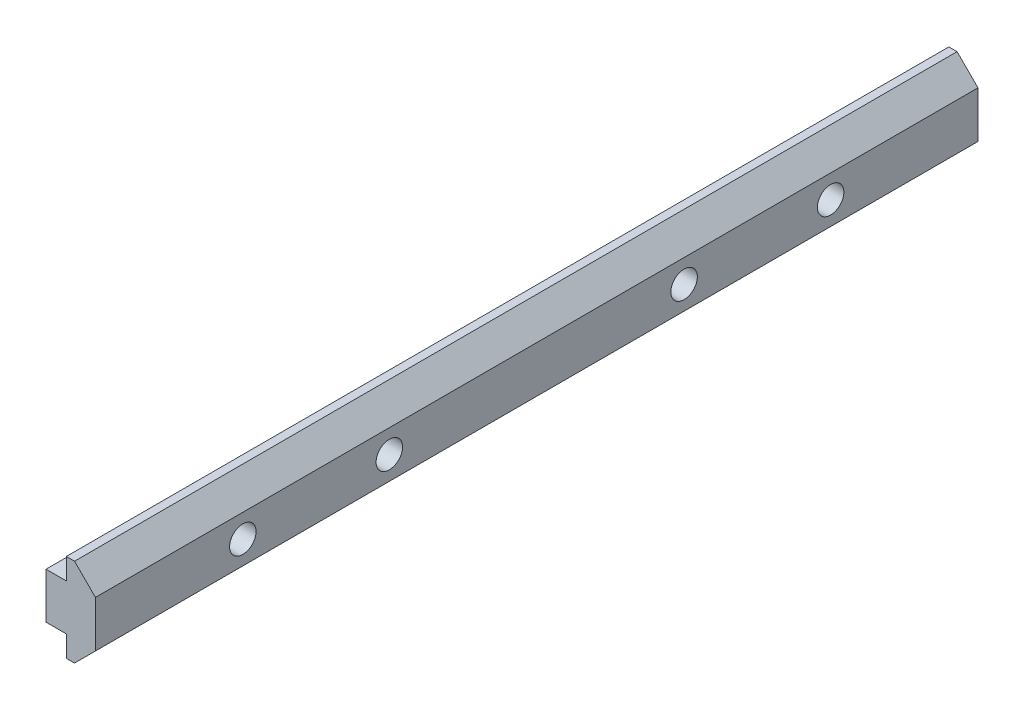
ISO-10303-21;
HEADER;
FILE_DESCRIPTION(('STEP AP214'),'2;1');
FILE_NAME('part.step','',(''),(''),'','','');
FILE_SCHEMA(('AUTOMOTIVE_DESIGN { 1 0 10303 214 1 1 1 1 }'));
ENDSEC;
DATA;
#1=APPLICATION_CONTEXT('core data for automotive mechanical design processes');
#2=APPLICATION_PROTOCOL_DEFINITION('international standard','automotive_design',2000,#1);
#3=PRODUCT_CONTEXT('',#1,'mechanical');
#4=PRODUCT('Part','Part','',(#3));
#5=PRODUCT_RELATED_PRODUCT_CATEGORY('part','',(#4));
#6=PRODUCT_DEFINITION_FORMATION('','',#4);
#7=PRODUCT_DEFINITION_CONTEXT('part definition',#1,'design');
#8=PRODUCT_DEFINITION('design','',#6,#7);
#9=PRODUCT_DEFINITION_SHAPE('','',#8);
#10=(LENGTH_UNIT() NAMED_UNIT(*) SI_UNIT(.MILLI.,.METRE.));
#11=(NAMED_UNIT(*) PLANE_ANGLE_UNIT() SI_UNIT($,.RADIAN.));
#12=(NAMED_UNIT(*) SI_UNIT($,.STERADIAN.) SOLID_ANGLE_UNIT());
#13=UNCERTAINTY_MEASURE_WITH_UNIT(LENGTH_MEASURE(1.E-05),#10,'distance_accuracy_value','');
#14=(GEOMETRIC_REPRESENTATION_CONTEXT(3) GLOBAL_UNCERTAINTY_ASSIGNED_CONTEXT((#13)) GLOBAL_UNIT_ASSIGNED_CONTEXT((#10,
#11,#12)) REPRESENTATION_CONTEXT('',''));
#15=CARTESIAN_POINT('',(0.,0.,0.));
#16=DIRECTION('',(0.,0.,1.));
#17=DIRECTION('',(1.,0.,0.));
#18=AXIS2_PLACEMENT_3D('',#15,#16,#17);
#19=CARTESIAN_POINT('',(-10.,-2.60000000000014,100.));
#20=DIRECTION('',(1.,0.,0.));
#21=DIRECTION('',(0.,0.,-1.));
#22=AXIS2_PLACEMENT_3D('',#19,#20,#21);
#23=PLANE('',#22);
#24=CARTESIAN_POINT('',(-10.,-1.4810201676152E-13,83.3));
#25=DIRECTION('',(-1.,0.,0.));
#26=DIRECTION('',(0.,0.,1.));
#27=AXIS2_PLACEMENT_3D('',#24,#25,#26);
#28=CIRCLE('',#27,1.5);
#29=CARTESIAN_POINT('',(-10.,-1.4810201676152E-13,84.8));
#30=VERTEX_POINT('',#29);
#31=EDGE_CURVE('E184',#30,#30,#28,.T.);
#32=ORIENTED_EDGE('',*,*,#31,.F.);
#33=EDGE_LOOP('',(#32));
#34=FACE_BOUND('',#33,.T.);
#35=CARTESIAN_POINT('',(-10.,-1.4810201676152E-13,33.3));
#36=DIRECTION('',(-1.,0.,0.));
#37=DIRECTION('',(0.,0.,-1.));
#38=AXIS2_PLACEMENT_3D('',#35,#36,#37);
#39=CIRCLE('',#38,1.5);
#40=CARTESIAN_POINT('',(-10.,-1.4810201676152E-13,31.8));
#41=VERTEX_POINT('',#40);
#42=EDGE_CURVE('E219',#41,#41,#39,.T.);
#43=ORIENTED_EDGE('',*,*,#42,.F.);
#44=EDGE_LOOP('',(#43));
#45=FACE_BOUND('',#44,.T.);
#46=CARTESIAN_POINT('',(-10.,-1.4810201676152E-13,16.7));
#47=DIRECTION('',(-1.,0.,0.));
#48=DIRECTION('',(0.,0.,-1.));
#49=AXIS2_PLACEMENT_3D('',#46,#47,#48);
#50=CIRCLE('',#49,1.5);
#51=CARTESIAN_POINT('',(-10.,-1.4810201676152E-13,15.2));
#52=VERTEX_POINT('',#51);
#53=EDGE_CURVE('E223',#52,#52,#50,.T.);
#54=ORIENTED_EDGE('',*,*,#53,.F.);
#55=EDGE_LOOP('',(#54));
#56=FACE_BOUND('',#55,.T.);
#57=CARTESIAN_POINT('',(-10.,-1.4810201676152E-13,66.7));
#58=DIRECTION('',(-1.,0.,0.));
#59=DIRECTION('',(0.,0.,1.));
#60=AXIS2_PLACEMENT_3D('',#57,#58,#59);
#61=CIRCLE('',#60,1.5);
#62=CARTESIAN_POINT('',(-10.,-1.4810201676152E-13,68.2));
#63=VERTEX_POINT('',#62);
#64=EDGE_CURVE('E227',#63,#63,#61,.T.);
#65=ORIENTED_EDGE('',*,*,#64,.F.);
#66=EDGE_LOOP('',(#65));
#67=FACE_BOUND('',#66,.T.);
#68=DIRECTION('',(0.,-1.,0.));
#69=VECTOR('',#68,1.);
#70=CARTESIAN_POINT('',(-10.,-2.60000000000014,0.));
#71=LINE('',#70,#69);
#72=CARTESIAN_POINT('',(-10.,2.59999999999985,0.));
#73=VERTEX_POINT('',#72);
#74=CARTESIAN_POINT('',(-10.,-2.60000000000014,0.));
#75=VERTEX_POINT('',#74);
#76=EDGE_CURVE('E144',#73,#75,#71,.T.);
#77=ORIENTED_EDGE('',*,*,#76,.T.);
#78=DIRECTION('',(0.,0.,-1.));
#79=VECTOR('',#78,1.);
#80=CARTESIAN_POINT('',(-10.,-2.60000000000014,100.));
#81=LINE('',#80,#79);
#82=CARTESIAN_POINT('',(-10.,-2.60000000000014,100.));
#83=VERTEX_POINT('',#82);
#84=EDGE_CURVE('E11',#83,#75,#81,.T.);
#85=ORIENTED_EDGE('',*,*,#84,.F.);
#86=DIRECTION('',(0.,-1.,0.));
#87=VECTOR('',#86,1.);
#88=CARTESIAN_POINT('',(-10.,-2.60000000000014,100.));
#89=LINE('',#88,#87);
#90=CARTESIAN_POINT('',(-10.,2.59999999999985,100.));
#91=VERTEX_POINT('',#90);
#92=EDGE_CURVE('E162',#91,#83,#89,.T.);
#93=ORIENTED_EDGE('',*,*,#92,.F.);
#94=DIRECTION('',(0.,0.,-1.));
#95=VECTOR('',#94,1.);
#96=CARTESIAN_POINT('',(-10.,2.59999999999985,100.));
#97=LINE('',#96,#95);
#98=EDGE_CURVE('E140',#91,#73,#97,.T.);
#99=ORIENTED_EDGE('',*,*,#98,.T.);
#100=EDGE_LOOP('',(#77,#85,#93,#99));
#101=FACE_BOUND('',#100,.T.);
#102=ADVANCED_FACE('F34',(#34,#45,#56,#67,#101),#23,.F.);
#103=CARTESIAN_POINT('',(-7.69999999999991,-2.60000000000014,100.));
#104=DIRECTION('',(0.,1.,0.));
#105=DIRECTION('',(-1.,0.,0.));
#106=AXIS2_PLACEMENT_3D('',#103,#104,#105);
#107=PLANE('',#106);
#108=DIRECTION('',(1.,0.,0.));
#109=VECTOR('',#108,1.);
#110=CARTESIAN_POINT('',(-7.69999999999991,-2.60000000000014,0.));
#111=LINE('',#110,#109);
#112=CARTESIAN_POINT('',(-7.69999999999991,-2.60000000000014,0.));
#113=VERTEX_POINT('',#112);
#114=EDGE_CURVE('E147',#75,#113,#111,.T.);
#115=ORIENTED_EDGE('',*,*,#114,.T.);
#116=DIRECTION('',(0.,0.,-1.));
#117=VECTOR('',#116,1.);
#118=CARTESIAN_POINT('',(-7.69999999999991,-2.60000000000014,100.));
#119=LINE('',#118,#117);
#120=CARTESIAN_POINT('',(-7.69999999999991,-2.60000000000014,100.));
#121=VERTEX_POINT('',#120);
#122=EDGE_CURVE('E43',#121,#113,#119,.T.);
#123=ORIENTED_EDGE('',*,*,#122,.F.);
#124=DIRECTION('',(1.,0.,0.));
#125=VECTOR('',#124,1.);
#126=CARTESIAN_POINT('',(-7.69999999999991,-2.60000000000014,100.));
#127=LINE('',#126,#125);
#128=EDGE_CURVE('E101',#83,#121,#127,.T.);
#129=ORIENTED_EDGE('',*,*,#128,.F.);
#130=ORIENTED_EDGE('',*,*,#84,.T.);
#131=EDGE_LOOP('',(#115,#123,#129,#130));
#132=FACE_BOUND('',#131,.T.);
#133=ADVANCED_FACE('F208',(#132),#107,.F.);
#134=CARTESIAN_POINT('',(-7.69999999999991,-5.00000000000014,100.));
#135=DIRECTION('',(1.,0.,0.));
#136=DIRECTION('',(0.,0.,-1.));
#137=AXIS2_PLACEMENT_3D('',#134,#135,#136);
#138=PLANE('',#137);
#139=DIRECTION('',(0.,-1.,0.));
#140=VECTOR('',#139,1.);
#141=CARTESIAN_POINT('',(-7.69999999999991,-5.00000000000014,0.));
#142=LINE('',#141,#140);
#143=CARTESIAN_POINT('',(-7.69999999999991,-5.00000000000014,0.));
#144=VERTEX_POINT('',#143);
#145=EDGE_CURVE('E149',#113,#144,#142,.T.);
#146=ORIENTED_EDGE('',*,*,#145,.T.);
#147=DIRECTION('',(0.,0.,-1.));
#148=VECTOR('',#147,1.);
#149=CARTESIAN_POINT('',(-7.69999999999991,-5.00000000000014,100.));
#150=LINE('',#149,#148);
#151=CARTESIAN_POINT('',(-7.69999999999991,-5.00000000000014,100.));
#152=VERTEX_POINT('',#151);
#153=EDGE_CURVE('E175',#152,#144,#150,.T.);
#154=ORIENTED_EDGE('',*,*,#153,.F.);
#155=DIRECTION('',(0.,-1.,0.));
#156=VECTOR('',#155,1.);
#157=CARTESIAN_POINT('',(-7.69999999999991,-5.00000000000014,100.));
#158=LINE('',#157,#156);
#159=EDGE_CURVE('E238',#121,#152,#158,.T.);
#160=ORIENTED_EDGE('',*,*,#159,.F.);
#161=ORIENTED_EDGE('',*,*,#122,.T.);
#162=EDGE_LOOP('',(#146,#154,#160,#161));
#163=FACE_BOUND('',#162,.T.);
#164=ADVANCED_FACE('F213',(#163),#138,.F.);
#165=CARTESIAN_POINT('',(-6.7677669529664,-5.00000000000014,100.));
#166=DIRECTION('',(0.,1.,0.));
#167=DIRECTION('',(0.,0.,1.));
#168=AXIS2_PLACEMENT_3D('',#165,#166,#167);
#169=PLANE('',#168);
#170=DIRECTION('',(1.,0.,0.));
#171=VECTOR('',#170,1.);
#172=CARTESIAN_POINT('',(-6.7677669529664,-5.00000000000014,0.));
#173=LINE('',#172,#171);
#174=CARTESIAN_POINT('',(-6.7677669529664,-5.00000000000014,0.));
#175=VERTEX_POINT('',#174);
#176=EDGE_CURVE('E151',#144,#175,#173,.T.);
#177=ORIENTED_EDGE('',*,*,#176,.T.);
#178=DIRECTION('',(0.,0.,-1.));
#179=VECTOR('',#178,1.);
#180=CARTESIAN_POINT('',(-6.7677669529664,-5.00000000000014,100.));
#181=LINE('',#180,#179);
#182=CARTESIAN_POINT('',(-6.7677669529664,-5.00000000000014,100.));
#183=VERTEX_POINT('',#182);
#184=EDGE_CURVE('E172',#183,#175,#181,.T.);
#185=ORIENTED_EDGE('',*,*,#184,.F.);
#186=DIRECTION('',(1.,0.,0.));
#187=VECTOR('',#186,1.);
#188=CARTESIAN_POINT('',(-6.7677669529664,-5.00000000000014,100.));
#189=LINE('',#188,#187);
#190=EDGE_CURVE('E240',#152,#183,#189,.T.);
#191=ORIENTED_EDGE('',*,*,#190,.F.);
#192=ORIENTED_EDGE('',*,*,#153,.T.);
#193=EDGE_LOOP('',(#177,#185,#191,#192));
#194=FACE_BOUND('',#193,.T.);
#195=ADVANCED_FACE('F263',(#194),#169,.F.);
#196=CARTESIAN_POINT('',(-4.40000000000005,-2.6322330470338,100.));
#197=DIRECTION('',(-0.707106781186548,0.707106781186548,0.));
#198=DIRECTION('',(-0.707106781186548,-0.707106781186548,0.));
#199=AXIS2_PLACEMENT_3D('',#196,#197,#198);
#200=PLANE('',#199);
#201=DIRECTION('',(0.707106781186548,0.707106781186548,0.));
#202=VECTOR('',#201,1.);
#203=CARTESIAN_POINT('',(-4.40000000000005,-2.6322330470338,0.));
#204=LINE('',#203,#202);
#205=CARTESIAN_POINT('',(-4.40000000000005,-2.6322330470338,0.));
#206=VERTEX_POINT('',#205);
#207=EDGE_CURVE('E153',#175,#206,#204,.T.);
#208=ORIENTED_EDGE('',*,*,#207,.T.);
#209=DIRECTION('',(0.,0.,-1.));
#210=VECTOR('',#209,1.);
#211=CARTESIAN_POINT('',(-4.40000000000005,-2.6322330470338,100.));
#212=LINE('',#211,#210);
#213=CARTESIAN_POINT('',(-4.40000000000005,-2.6322330470338,100.));
#214=VERTEX_POINT('',#213);
#215=EDGE_CURVE('E169',#214,#206,#212,.T.);
#216=ORIENTED_EDGE('',*,*,#215,.F.);
#217=DIRECTION('',(0.707106781186548,0.707106781186548,0.));
#218=VECTOR('',#217,1.);
#219=CARTESIAN_POINT('',(-4.40000000000005,-2.6322330470338,100.));
#220=LINE('',#219,#218);
#221=EDGE_CURVE('E242',#183,#214,#220,.T.);
#222=ORIENTED_EDGE('',*,*,#221,.F.);
#223=ORIENTED_EDGE('',*,*,#184,.T.);
#224=EDGE_LOOP('',(#208,#216,#222,#223));
#225=FACE_BOUND('',#224,.T.);
#226=ADVANCED_FACE('F260',(#225),#200,.F.);
#227=CARTESIAN_POINT('',(-4.40000000000005,2.63223304703347,100.));
#228=DIRECTION('',(-1.,0.,0.));
#229=DIRECTION('',(0.,-1.,0.));
#230=AXIS2_PLACEMENT_3D('',#227,#228,#229);
#231=PLANE('',#230);
#232=CARTESIAN_POINT('',(-4.40000000000005,-1.4810201676152E-13,83.3));
#233=DIRECTION('',(-1.,0.,0.));
#234=DIRECTION('',(0.,-1.,0.));
#235=AXIS2_PLACEMENT_3D('',#232,#233,#234);
#236=CIRCLE('',#235,1.5);
#237=CARTESIAN_POINT('',(-4.40000000000005,-1.50000000000015,83.3));
#238=VERTEX_POINT('',#237);
#239=EDGE_CURVE('E37',#238,#238,#236,.T.);
#240=ORIENTED_EDGE('',*,*,#239,.T.);
#241=EDGE_LOOP('',(#240));
#242=FACE_BOUND('',#241,.T.);
#243=CARTESIAN_POINT('',(-4.40000000000005,-1.4810201676152E-13,33.3));
#244=DIRECTION('',(-1.,0.,0.));
#245=DIRECTION('',(0.,-1.,0.));
#246=AXIS2_PLACEMENT_3D('',#243,#244,#245);
#247=CIRCLE('',#246,1.5);
#248=CARTESIAN_POINT('',(-4.40000000000005,-1.50000000000015,33.3));
#249=VERTEX_POINT('',#248);
#250=EDGE_CURVE('E186',#249,#249,#247,.T.);
#251=ORIENTED_EDGE('',*,*,#250,.T.);
#252=EDGE_LOOP('',(#251));
#253=FACE_BOUND('',#252,.T.);
#254=CARTESIAN_POINT('',(-4.40000000000005,-1.4810201676152E-13,16.7));
#255=DIRECTION('',(-1.,0.,0.));
#256=DIRECTION('',(0.,-1.,0.));
#257=AXIS2_PLACEMENT_3D('',#254,#255,#256);
#258=CIRCLE('',#257,1.5);
#259=CARTESIAN_POINT('',(-4.40000000000005,-1.50000000000015,16.7));
#260=VERTEX_POINT('',#259);
#261=EDGE_CURVE('E183',#260,#260,#258,.T.);
#262=ORIENTED_EDGE('',*,*,#261,.T.);
#263=EDGE_LOOP('',(#262));
#264=FACE_BOUND('',#263,.T.);
#265=CARTESIAN_POINT('',(-4.40000000000005,-1.4810201676152E-13,66.7));
#266=DIRECTION('',(-1.,0.,0.));
#267=DIRECTION('',(0.,-1.,0.));
#268=AXIS2_PLACEMENT_3D('',#265,#266,#267);
#269=CIRCLE('',#268,1.5);
#270=CARTESIAN_POINT('',(-4.40000000000005,-1.50000000000015,66.7));
#271=VERTEX_POINT('',#270);
#272=EDGE_CURVE('E180',#271,#271,#269,.T.);
#273=ORIENTED_EDGE('',*,*,#272,.T.);
#274=EDGE_LOOP('',(#273));
#275=FACE_BOUND('',#274,.T.);
#276=DIRECTION('',(0.,1.,0.));
#277=VECTOR('',#276,1.);
#278=CARTESIAN_POINT('',(-4.40000000000005,2.63223304703347,0.));
#279=LINE('',#278,#277);
#280=CARTESIAN_POINT('',(-4.40000000000005,2.63223304703347,0.));
#281=VERTEX_POINT('',#280);
#282=EDGE_CURVE('E155',#206,#281,#279,.T.);
#283=ORIENTED_EDGE('',*,*,#282,.T.);
#284=DIRECTION('',(0.,0.,-1.));
#285=VECTOR('',#284,1.);
#286=CARTESIAN_POINT('',(-4.40000000000005,2.63223304703347,100.));
#287=LINE('',#286,#285);
#288=CARTESIAN_POINT('',(-4.40000000000005,2.63223304703347,100.));
#289=VERTEX_POINT('',#288);
#290=EDGE_CURVE('E166',#289,#281,#287,.T.);
#291=ORIENTED_EDGE('',*,*,#290,.F.);
#292=DIRECTION('',(0.,1.,0.));
#293=VECTOR('',#292,1.);
#294=CARTESIAN_POINT('',(-4.40000000000005,2.63223304703347,100.));
#295=LINE('',#294,#293);
#296=EDGE_CURVE('E248',#214,#289,#295,.T.);
#297=ORIENTED_EDGE('',*,*,#296,.F.);
#298=ORIENTED_EDGE('',*,*,#215,.T.);
#299=EDGE_LOOP('',(#283,#291,#297,#298));
#300=FACE_BOUND('',#299,.T.);
#301=ADVANCED_FACE('F193',(#242,#253,#264,#275,#300),#231,.F.);
#302=CARTESIAN_POINT('',(-6.76776695296643,4.99999999999984,100.));
#303=DIRECTION('',(-0.707106781186547,-0.707106781186548,0.));
#304=DIRECTION('',(0.707106781186548,-0.707106781186547,0.));
#305=AXIS2_PLACEMENT_3D('',#302,#303,#304);
#306=PLANE('',#305);
#307=DIRECTION('',(-0.707106781186548,0.707106781186547,0.));
#308=VECTOR('',#307,1.);
#309=CARTESIAN_POINT('',(-6.76776695296643,4.99999999999984,0.));
#310=LINE('',#309,#308);
#311=CARTESIAN_POINT('',(-6.76776695296643,4.99999999999984,0.));
#312=VERTEX_POINT('',#311);
#313=EDGE_CURVE('E157',#281,#312,#310,.T.);
#314=ORIENTED_EDGE('',*,*,#313,.T.);
#315=DIRECTION('',(0.,0.,-1.));
#316=VECTOR('',#315,1.);
#317=CARTESIAN_POINT('',(-6.76776695296643,4.99999999999984,100.));
#318=LINE('',#317,#316);
#319=CARTESIAN_POINT('',(-6.76776695296643,4.99999999999984,100.));
#320=VERTEX_POINT('',#319);
#321=EDGE_CURVE('E135',#320,#312,#318,.T.);
#322=ORIENTED_EDGE('',*,*,#321,.F.);
#323=DIRECTION('',(-0.707106781186548,0.707106781186547,0.));
#324=VECTOR('',#323,1.);
#325=CARTESIAN_POINT('',(-6.76776695296643,4.99999999999984,100.));
#326=LINE('',#325,#324);
#327=EDGE_CURVE('E126',#289,#320,#326,.T.);
#328=ORIENTED_EDGE('',*,*,#327,.F.);
#329=ORIENTED_EDGE('',*,*,#290,.T.);
#330=EDGE_LOOP('',(#314,#322,#328,#329));
#331=FACE_BOUND('',#330,.T.);
#332=ADVANCED_FACE('F257',(#331),#306,.F.);
#333=CARTESIAN_POINT('',(-7.70000000000006,4.99999999999984,100.));
#334=DIRECTION('',(0.,-1.,0.));
#335=DIRECTION('',(0.,0.,-1.));
#336=AXIS2_PLACEMENT_3D('',#333,#334,#335);
#337=PLANE('',#336);
#338=DIRECTION('',(-1.,0.,0.));
#339=VECTOR('',#338,1.);
#340=CARTESIAN_POINT('',(-7.70000000000006,4.99999999999984,0.));
#341=LINE('',#340,#339);
#342=CARTESIAN_POINT('',(-7.70000000000006,4.99999999999984,0.));
#343=VERTEX_POINT('',#342);
#344=EDGE_CURVE('E134',#312,#343,#341,.T.);
#345=ORIENTED_EDGE('',*,*,#344,.T.);
#346=DIRECTION('',(0.,0.,-1.));
#347=VECTOR('',#346,1.);
#348=CARTESIAN_POINT('',(-7.70000000000006,4.99999999999984,100.));
#349=LINE('',#348,#347);
#350=CARTESIAN_POINT('',(-7.70000000000006,4.99999999999984,100.));
#351=VERTEX_POINT('',#350);
#352=EDGE_CURVE('E131',#351,#343,#349,.T.);
#353=ORIENTED_EDGE('',*,*,#352,.F.);
#354=DIRECTION('',(-1.,0.,0.));
#355=VECTOR('',#354,1.);
#356=CARTESIAN_POINT('',(-7.70000000000006,4.99999999999984,100.));
#357=LINE('',#356,#355);
#358=EDGE_CURVE('E120',#320,#351,#357,.T.);
#359=ORIENTED_EDGE('',*,*,#358,.F.);
#360=ORIENTED_EDGE('',*,*,#321,.T.);
#361=EDGE_LOOP('',(#345,#353,#359,#360));
#362=FACE_BOUND('',#361,.T.);
#363=ADVANCED_FACE('F132',(#362),#337,.F.);
#364=CARTESIAN_POINT('',(-7.70000000000006,2.59999999999985,100.));
#365=DIRECTION('',(1.,0.,0.));
#366=DIRECTION('',(0.,0.,-1.));
#367=AXIS2_PLACEMENT_3D('',#364,#365,#366);
#368=PLANE('',#367);
#369=DIRECTION('',(0.,-1.,0.));
#370=VECTOR('',#369,1.);
#371=CARTESIAN_POINT('',(-7.70000000000006,2.59999999999985,0.));
#372=LINE('',#371,#370);
#373=CARTESIAN_POINT('',(-7.70000000000006,2.59999999999985,0.));
#374=VERTEX_POINT('',#373);
#375=EDGE_CURVE('E87',#343,#374,#372,.T.);
#376=ORIENTED_EDGE('',*,*,#375,.T.);
#377=DIRECTION('',(0.,0.,-1.));
#378=VECTOR('',#377,1.);
#379=CARTESIAN_POINT('',(-7.70000000000006,2.59999999999985,100.));
#380=LINE('',#379,#378);
#381=CARTESIAN_POINT('',(-7.70000000000006,2.59999999999985,100.));
#382=VERTEX_POINT('',#381);
#383=EDGE_CURVE('E136',#382,#374,#380,.T.);
#384=ORIENTED_EDGE('',*,*,#383,.F.);
#385=DIRECTION('',(0.,-1.,0.));
#386=VECTOR('',#385,1.);
#387=CARTESIAN_POINT('',(-7.70000000000006,2.59999999999985,100.));
#388=LINE('',#387,#386);
#389=EDGE_CURVE('E124',#351,#382,#388,.T.);
#390=ORIENTED_EDGE('',*,*,#389,.F.);
#391=ORIENTED_EDGE('',*,*,#352,.T.);
#392=EDGE_LOOP('',(#376,#384,#390,#391));
#393=FACE_BOUND('',#392,.T.);
#394=ADVANCED_FACE('F138',(#393),#368,.F.);
#395=CARTESIAN_POINT('',(-10.,2.59999999999985,100.));
#396=DIRECTION('',(0.,-1.,0.));
#397=DIRECTION('',(0.,0.,-1.));
#398=AXIS2_PLACEMENT_3D('',#395,#396,#397);
#399=PLANE('',#398);
#400=DIRECTION('',(-1.,0.,0.));
#401=VECTOR('',#400,1.);
#402=CARTESIAN_POINT('',(-10.,2.59999999999985,0.));
#403=LINE('',#402,#401);
#404=EDGE_CURVE('E93',#374,#73,#403,.T.);
#405=ORIENTED_EDGE('',*,*,#404,.T.);
#406=ORIENTED_EDGE('',*,*,#98,.F.);
#407=DIRECTION('',(-1.,0.,0.));
#408=VECTOR('',#407,1.);
#409=CARTESIAN_POINT('',(-10.,2.59999999999985,100.));
#410=LINE('',#409,#408);
#411=EDGE_CURVE('E52',#382,#91,#410,.T.);
#412=ORIENTED_EDGE('',*,*,#411,.F.);
#413=ORIENTED_EDGE('',*,*,#383,.T.);
#414=EDGE_LOOP('',(#405,#406,#412,#413));
#415=FACE_BOUND('',#414,.T.);
#416=ADVANCED_FACE('F281',(#415),#399,.F.);
#417=CARTESIAN_POINT('',(0.,0.,100.));
#418=DIRECTION('',(0.,0.,-1.));
#419=DIRECTION('',(-1.,0.,0.));
#420=AXIS2_PLACEMENT_3D('',#417,#418,#419);
#421=PLANE('',#420);
#422=ORIENTED_EDGE('',*,*,#92,.T.);
#423=ORIENTED_EDGE('',*,*,#128,.T.);
#424=ORIENTED_EDGE('',*,*,#159,.T.);
#425=ORIENTED_EDGE('',*,*,#190,.T.);
#426=ORIENTED_EDGE('',*,*,#221,.T.);
#427=ORIENTED_EDGE('',*,*,#296,.T.);
#428=ORIENTED_EDGE('',*,*,#327,.T.);
#429=ORIENTED_EDGE('',*,*,#358,.T.);
#430=ORIENTED_EDGE('',*,*,#389,.T.);
#431=ORIENTED_EDGE('',*,*,#411,.T.);
#432=EDGE_LOOP('',(#422,#423,#424,#425,#426,#427,#428,#429,#430,#431));
#433=FACE_BOUND('',#432,.T.);
#434=ADVANCED_FACE('F122',(#433),#421,.F.);
#435=CARTESIAN_POINT('',(0.,0.,0.));
#436=DIRECTION('',(0.,0.,-1.));
#437=DIRECTION('',(-1.,0.,0.));
#438=AXIS2_PLACEMENT_3D('',#435,#436,#437);
#439=PLANE('',#438);
#440=ORIENTED_EDGE('',*,*,#76,.F.);
#441=ORIENTED_EDGE('',*,*,#404,.F.);
#442=ORIENTED_EDGE('',*,*,#375,.F.);
#443=ORIENTED_EDGE('',*,*,#344,.F.);
#444=ORIENTED_EDGE('',*,*,#313,.F.);
#445=ORIENTED_EDGE('',*,*,#282,.F.);
#446=ORIENTED_EDGE('',*,*,#207,.F.);
#447=ORIENTED_EDGE('',*,*,#176,.F.);
#448=ORIENTED_EDGE('',*,*,#145,.F.);
#449=ORIENTED_EDGE('',*,*,#114,.F.);
#450=EDGE_LOOP('',(#440,#441,#442,#443,#444,#445,#446,#447,#448,#449));
#451=FACE_BOUND('',#450,.T.);
#452=ADVANCED_FACE('F232',(#451),#439,.T.);
#453=CARTESIAN_POINT('',(10.,-1.4810201676152E-13,66.7));
#454=DIRECTION('',(-1.,0.,0.));
#455=DIRECTION('',(0.,0.,1.));
#456=AXIS2_PLACEMENT_3D('',#453,#454,#455);
#457=CYLINDRICAL_SURFACE('',#456,1.5);
#458=ORIENTED_EDGE('',*,*,#64,.T.);
#459=EDGE_LOOP('',(#458));
#460=FACE_BOUND('',#459,.T.);
#461=ORIENTED_EDGE('',*,*,#272,.F.);
#462=EDGE_LOOP('',(#461));
#463=FACE_BOUND('',#462,.T.);
#464=ADVANCED_FACE('F286',(#460,#463),#457,.F.);
#465=CARTESIAN_POINT('',(10.,-1.4810201676152E-13,16.7));
#466=DIRECTION('',(-1.,0.,0.));
#467=DIRECTION('',(0.,0.,1.));
#468=AXIS2_PLACEMENT_3D('',#465,#466,#467);
#469=CYLINDRICAL_SURFACE('',#468,1.5);
#470=ORIENTED_EDGE('',*,*,#53,.T.);
#471=EDGE_LOOP('',(#470));
#472=FACE_BOUND('',#471,.T.);
#473=ORIENTED_EDGE('',*,*,#261,.F.);
#474=EDGE_LOOP('',(#473));
#475=FACE_BOUND('',#474,.T.);
#476=ADVANCED_FACE('F203',(#472,#475),#469,.F.);
#477=CARTESIAN_POINT('',(10.,-1.4810201676152E-13,33.3));
#478=DIRECTION('',(-1.,0.,0.));
#479=DIRECTION('',(0.,0.,1.));
#480=AXIS2_PLACEMENT_3D('',#477,#478,#479);
#481=CYLINDRICAL_SURFACE('',#480,1.5);
#482=ORIENTED_EDGE('',*,*,#42,.T.);
#483=EDGE_LOOP('',(#482));
#484=FACE_BOUND('',#483,.T.);
#485=ORIENTED_EDGE('',*,*,#250,.F.);
#486=EDGE_LOOP('',(#485));
#487=FACE_BOUND('',#486,.T.);
#488=ADVANCED_FACE('F197',(#484,#487),#481,.F.);
#489=CARTESIAN_POINT('',(10.,-1.4810201676152E-13,83.3));
#490=DIRECTION('',(-1.,0.,0.));
#491=DIRECTION('',(0.,0.,1.));
#492=AXIS2_PLACEMENT_3D('',#489,#490,#491);
#493=CYLINDRICAL_SURFACE('',#492,1.5);
#494=ORIENTED_EDGE('',*,*,#31,.T.);
#495=EDGE_LOOP('',(#494));
#496=FACE_BOUND('',#495,.T.);
#497=ORIENTED_EDGE('',*,*,#239,.F.);
#498=EDGE_LOOP('',(#497));
#499=FACE_BOUND('',#498,.T.);
#500=ADVANCED_FACE('F195',(#496,#499),#493,.F.);
#501=CLOSED_SHELL('',(#102,#133,#164,#195,#226,#301,#332,#363,#394,#416,#434,#452,#464,#476,
#488,#500));
#502=MANIFOLD_SOLID_BREP('B2',#501);
#503=ADVANCED_BREP_SHAPE_REPRESENTATION('',(#18,#502),#14);
#504=SHAPE_DEFINITION_REPRESENTATION(#9,#503);
ENDSEC;
END-ISO-10303-21;
